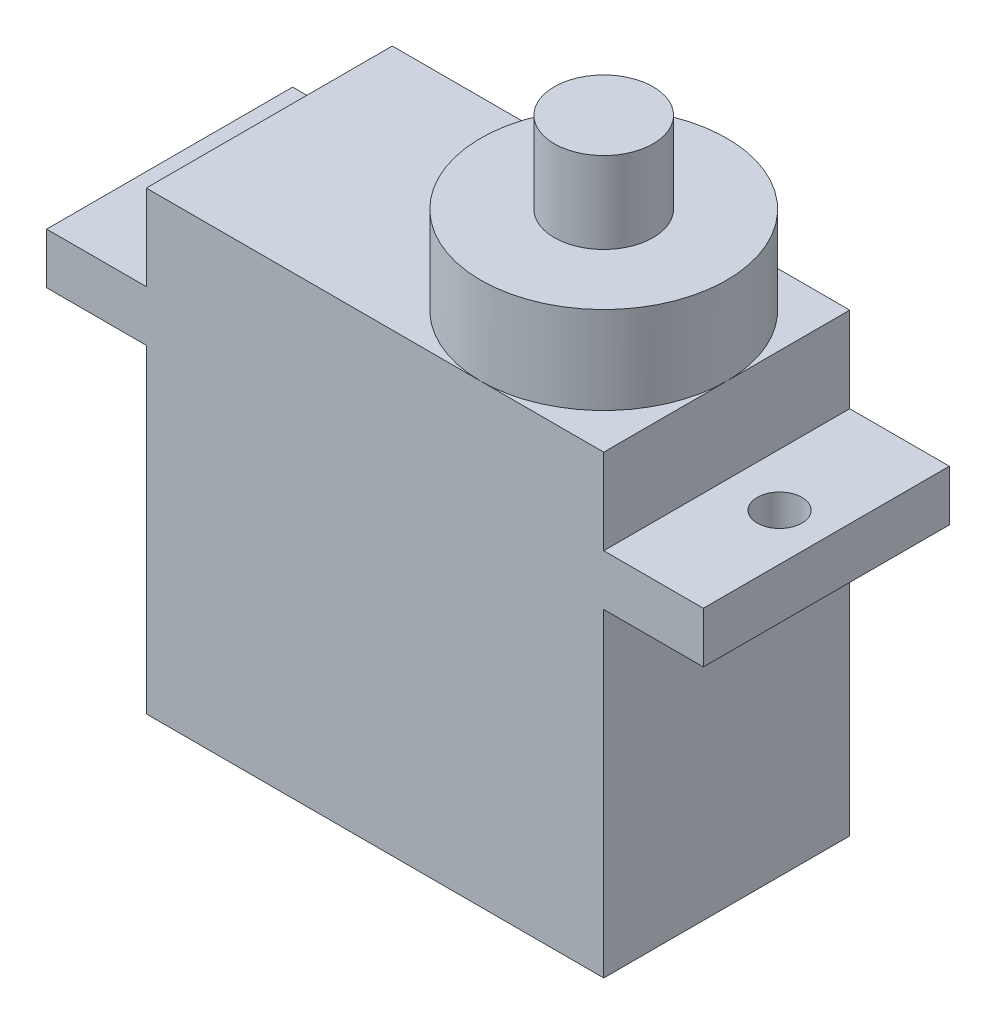
ISO-10303-21;
HEADER;
FILE_DESCRIPTION(('STEP AP214'),'2;1');
FILE_NAME('part.step','',(''),(''),'','','');
FILE_SCHEMA(('AUTOMOTIVE_DESIGN { 1 0 10303 214 1 1 1 1 }'));
ENDSEC;
DATA;
#1=APPLICATION_CONTEXT('core data for automotive mechanical design processes');
#2=APPLICATION_PROTOCOL_DEFINITION('international standard','automotive_design',2000,#1);
#3=PRODUCT_CONTEXT('',#1,'mechanical');
#4=PRODUCT('Part','Part','',(#3));
#5=PRODUCT_RELATED_PRODUCT_CATEGORY('part','',(#4));
#6=PRODUCT_DEFINITION_FORMATION('','',#4);
#7=PRODUCT_DEFINITION_CONTEXT('part definition',#1,'design');
#8=PRODUCT_DEFINITION('design','',#6,#7);
#9=PRODUCT_DEFINITION_SHAPE('','',#8);
#10=(LENGTH_UNIT() NAMED_UNIT(*) SI_UNIT(.MILLI.,.METRE.));
#11=(NAMED_UNIT(*) PLANE_ANGLE_UNIT() SI_UNIT($,.RADIAN.));
#12=(NAMED_UNIT(*) SI_UNIT($,.STERADIAN.) SOLID_ANGLE_UNIT());
#13=UNCERTAINTY_MEASURE_WITH_UNIT(LENGTH_MEASURE(1.E-05),#10,'distance_accuracy_value','');
#14=(GEOMETRIC_REPRESENTATION_CONTEXT(3) GLOBAL_UNCERTAINTY_ASSIGNED_CONTEXT((#13)) GLOBAL_UNIT_ASSIGNED_CONTEXT((#10,
#11,#12)) REPRESENTATION_CONTEXT('',''));
#15=CARTESIAN_POINT('',(0.,0.,0.));
#16=DIRECTION('',(0.,0.,1.));
#17=DIRECTION('',(1.,0.,0.));
#18=AXIS2_PLACEMENT_3D('',#15,#16,#17);
#19=CARTESIAN_POINT('',(22.5,22.4,12.1));
#20=DIRECTION('',(0.,-1.,0.));
#21=DIRECTION('',(0.,0.,-1.));
#22=AXIS2_PLACEMENT_3D('',#19,#20,#21);
#23=PLANE('',#22);
#24=CARTESIAN_POINT('',(16.45,22.4,6.05));
#25=DIRECTION('',(0.,1.,0.));
#26=DIRECTION('',(0.,0.,1.));
#27=AXIS2_PLACEMENT_3D('',#24,#25,#26);
#28=CIRCLE('',#27,6.05);
#29=CARTESIAN_POINT('',(16.45,22.4,12.1));
#30=VERTEX_POINT('',#29);
#31=CARTESIAN_POINT('',(22.5,22.4,6.05));
#32=VERTEX_POINT('',#31);
#33=EDGE_CURVE('E158',#30,#32,#28,.T.);
#34=ORIENTED_EDGE('',*,*,#33,.F.);
#35=DIRECTION('',(-1.,0.,0.));
#36=VECTOR('',#35,1.);
#37=CARTESIAN_POINT('',(22.5,22.4,12.1));
#38=LINE('',#37,#36);
#39=CARTESIAN_POINT('',(22.5,22.4,12.1));
#40=VERTEX_POINT('',#39);
#41=EDGE_CURVE('E140',#40,#30,#38,.T.);
#42=ORIENTED_EDGE('',*,*,#41,.F.);
#43=DIRECTION('',(0.,0.,-1.));
#44=VECTOR('',#43,1.);
#45=CARTESIAN_POINT('',(22.5,22.4,12.1));
#46=LINE('',#45,#44);
#47=EDGE_CURVE('E159',#40,#32,#46,.T.);
#48=ORIENTED_EDGE('',*,*,#47,.T.);
#49=EDGE_LOOP('',(#34,#42,#48));
#50=FACE_BOUND('',#49,.T.);
#51=ADVANCED_FACE('F40',(#50),#23,.F.);
#52=CARTESIAN_POINT('',(16.45,22.4,0.));
#53=VERTEX_POINT('',#52);
#54=EDGE_CURVE('E49',#32,#53,#28,.T.);
#55=ORIENTED_EDGE('',*,*,#54,.F.);
#56=CARTESIAN_POINT('',(22.5,22.4,0.));
#57=VERTEX_POINT('',#56);
#58=EDGE_CURVE('E230',#32,#57,#46,.T.);
#59=ORIENTED_EDGE('',*,*,#58,.T.);
#60=DIRECTION('',(-1.,0.,0.));
#61=VECTOR('',#60,1.);
#62=CARTESIAN_POINT('',(22.5,22.4,0.));
#63=LINE('',#62,#61);
#64=EDGE_CURVE('E209',#57,#53,#63,.T.);
#65=ORIENTED_EDGE('',*,*,#64,.T.);
#66=EDGE_LOOP('',(#55,#59,#65));
#67=FACE_BOUND('',#66,.T.);
#68=ADVANCED_FACE('F302',(#67),#23,.F.);
#69=CARTESIAN_POINT('',(0.,0.,12.1));
#70=DIRECTION('',(1.,0.,0.));
#71=DIRECTION('',(0.,0.,-1.));
#72=AXIS2_PLACEMENT_3D('',#69,#70,#71);
#73=PLANE('',#72);
#74=DIRECTION('',(0.,-1.,0.));
#75=VECTOR('',#74,1.);
#76=CARTESIAN_POINT('',(0.,0.,0.));
#77=LINE('',#76,#75);
#78=CARTESIAN_POINT('',(0.,15.7,0.));
#79=VERTEX_POINT('',#78);
#80=CARTESIAN_POINT('',(0.,0.,0.));
#81=VERTEX_POINT('',#80);
#82=EDGE_CURVE('E192',#79,#81,#77,.T.);
#83=ORIENTED_EDGE('',*,*,#82,.T.);
#84=DIRECTION('',(0.,0.,-1.));
#85=VECTOR('',#84,1.);
#86=CARTESIAN_POINT('',(0.,0.,12.1));
#87=LINE('',#86,#85);
#88=CARTESIAN_POINT('',(0.,0.,12.1));
#89=VERTEX_POINT('',#88);
#90=EDGE_CURVE('E165',#89,#81,#87,.T.);
#91=ORIENTED_EDGE('',*,*,#90,.F.);
#92=DIRECTION('',(0.,-1.,0.));
#93=VECTOR('',#92,1.);
#94=CARTESIAN_POINT('',(0.,0.,12.1));
#95=LINE('',#94,#93);
#96=CARTESIAN_POINT('',(0.,15.7,12.1));
#97=VERTEX_POINT('',#96);
#98=EDGE_CURVE('E170',#97,#89,#95,.T.);
#99=ORIENTED_EDGE('',*,*,#98,.F.);
#100=DIRECTION('',(0.,0.,-1.));
#101=VECTOR('',#100,1.);
#102=CARTESIAN_POINT('',(0.,15.7,12.1));
#103=LINE('',#102,#101);
#104=EDGE_CURVE('E191',#97,#79,#103,.T.);
#105=ORIENTED_EDGE('',*,*,#104,.T.);
#106=EDGE_LOOP('',(#83,#91,#99,#105));
#107=FACE_BOUND('',#106,.T.);
#108=ADVANCED_FACE('F42',(#107),#73,.F.);
#109=CARTESIAN_POINT('',(0.,0.,12.1));
#110=DIRECTION('',(0.,1.,0.));
#111=DIRECTION('',(0.,0.,1.));
#112=AXIS2_PLACEMENT_3D('',#109,#110,#111);
#113=PLANE('',#112);
#114=DIRECTION('',(1.,0.,0.));
#115=VECTOR('',#114,1.);
#116=CARTESIAN_POINT('',(0.,0.,0.));
#117=LINE('',#116,#115);
#118=CARTESIAN_POINT('',(22.5,0.,0.));
#119=VERTEX_POINT('',#118);
#120=EDGE_CURVE('E195',#81,#119,#117,.T.);
#121=ORIENTED_EDGE('',*,*,#120,.T.);
#122=DIRECTION('',(0.,0.,-1.));
#123=VECTOR('',#122,1.);
#124=CARTESIAN_POINT('',(22.5,0.,12.1));
#125=LINE('',#124,#123);
#126=CARTESIAN_POINT('',(22.5,0.,12.1));
#127=VERTEX_POINT('',#126);
#128=EDGE_CURVE('E167',#127,#119,#125,.T.);
#129=ORIENTED_EDGE('',*,*,#128,.F.);
#130=DIRECTION('',(1.,0.,0.));
#131=VECTOR('',#130,1.);
#132=CARTESIAN_POINT('',(0.,0.,12.1));
#133=LINE('',#132,#131);
#134=EDGE_CURVE('E172',#89,#127,#133,.T.);
#135=ORIENTED_EDGE('',*,*,#134,.F.);
#136=ORIENTED_EDGE('',*,*,#90,.T.);
#137=EDGE_LOOP('',(#121,#129,#135,#136));
#138=FACE_BOUND('',#137,.T.);
#139=ADVANCED_FACE('F270',(#138),#113,.F.);
#140=CARTESIAN_POINT('',(22.5,0.,12.1));
#141=DIRECTION('',(-1.,0.,0.));
#142=DIRECTION('',(0.,0.,1.));
#143=AXIS2_PLACEMENT_3D('',#140,#141,#142);
#144=PLANE('',#143);
#145=DIRECTION('',(0.,1.,0.));
#146=VECTOR('',#145,1.);
#147=CARTESIAN_POINT('',(22.5,0.,0.));
#148=LINE('',#147,#146);
#149=CARTESIAN_POINT('',(22.5,15.7,0.));
#150=VERTEX_POINT('',#149);
#151=EDGE_CURVE('E197',#119,#150,#148,.T.);
#152=ORIENTED_EDGE('',*,*,#151,.T.);
#153=DIRECTION('',(0.,0.,-1.));
#154=VECTOR('',#153,1.);
#155=CARTESIAN_POINT('',(22.5,15.7,12.1));
#156=LINE('',#155,#154);
#157=CARTESIAN_POINT('',(22.5,15.7,12.1));
#158=VERTEX_POINT('',#157);
#159=EDGE_CURVE('E241',#158,#150,#156,.T.);
#160=ORIENTED_EDGE('',*,*,#159,.F.);
#161=DIRECTION('',(0.,1.,0.));
#162=VECTOR('',#161,1.);
#163=CARTESIAN_POINT('',(22.5,0.,12.1));
#164=LINE('',#163,#162);
#165=EDGE_CURVE('E175',#127,#158,#164,.T.);
#166=ORIENTED_EDGE('',*,*,#165,.F.);
#167=ORIENTED_EDGE('',*,*,#128,.T.);
#168=EDGE_LOOP('',(#152,#160,#166,#167));
#169=FACE_BOUND('',#168,.T.);
#170=ADVANCED_FACE('F249',(#169),#144,.F.);
#171=CARTESIAN_POINT('',(22.5,15.7,12.1));
#172=DIRECTION('',(0.,1.,0.));
#173=DIRECTION('',(0.,0.,1.));
#174=AXIS2_PLACEMENT_3D('',#171,#172,#173);
#175=PLANE('',#174);
#176=CARTESIAN_POINT('',(25.1,15.7,6.05));
#177=DIRECTION('',(0.,1.,0.));
#178=DIRECTION('',(0.,0.,1.));
#179=AXIS2_PLACEMENT_3D('',#176,#177,#178);
#180=CIRCLE('',#179,1.1);
#181=CARTESIAN_POINT('',(25.1,15.7,7.15));
#182=VERTEX_POINT('',#181);
#183=EDGE_CURVE('E533',#182,#182,#180,.T.);
#184=ORIENTED_EDGE('',*,*,#183,.T.);
#185=EDGE_LOOP('',(#184));
#186=FACE_BOUND('',#185,.T.);
#187=DIRECTION('',(1.,0.,0.));
#188=VECTOR('',#187,1.);
#189=CARTESIAN_POINT('',(22.5,15.7,0.));
#190=LINE('',#189,#188);
#191=CARTESIAN_POINT('',(27.4,15.7,0.));
#192=VERTEX_POINT('',#191);
#193=EDGE_CURVE('E199',#150,#192,#190,.T.);
#194=ORIENTED_EDGE('',*,*,#193,.T.);
#195=DIRECTION('',(0.,0.,-1.));
#196=VECTOR('',#195,1.);
#197=CARTESIAN_POINT('',(27.4,15.7,12.1));
#198=LINE('',#197,#196);
#199=CARTESIAN_POINT('',(27.4,15.7,12.1));
#200=VERTEX_POINT('',#199);
#201=EDGE_CURVE('E238',#200,#192,#198,.T.);
#202=ORIENTED_EDGE('',*,*,#201,.F.);
#203=DIRECTION('',(1.,0.,0.));
#204=VECTOR('',#203,1.);
#205=CARTESIAN_POINT('',(22.5,15.7,12.1));
#206=LINE('',#205,#204);
#207=EDGE_CURVE('E177',#158,#200,#206,.T.);
#208=ORIENTED_EDGE('',*,*,#207,.F.);
#209=ORIENTED_EDGE('',*,*,#159,.T.);
#210=EDGE_LOOP('',(#194,#202,#208,#209));
#211=FACE_BOUND('',#210,.T.);
#212=ADVANCED_FACE('F260',(#186,#211),#175,.F.);
#213=CARTESIAN_POINT('',(27.4,15.7,12.1));
#214=DIRECTION('',(-1.,0.,0.));
#215=DIRECTION('',(0.,0.,1.));
#216=AXIS2_PLACEMENT_3D('',#213,#214,#215);
#217=PLANE('',#216);
#218=DIRECTION('',(0.,1.,0.));
#219=VECTOR('',#218,1.);
#220=CARTESIAN_POINT('',(27.4,15.7,0.));
#221=LINE('',#220,#219);
#222=CARTESIAN_POINT('',(27.4,18.2,0.));
#223=VERTEX_POINT('',#222);
#224=EDGE_CURVE('E201',#192,#223,#221,.T.);
#225=ORIENTED_EDGE('',*,*,#224,.T.);
#226=DIRECTION('',(0.,0.,-1.));
#227=VECTOR('',#226,1.);
#228=CARTESIAN_POINT('',(27.4,18.2,12.1));
#229=LINE('',#228,#227);
#230=CARTESIAN_POINT('',(27.4,18.2,12.1));
#231=VERTEX_POINT('',#230);
#232=EDGE_CURVE('E235',#231,#223,#229,.T.);
#233=ORIENTED_EDGE('',*,*,#232,.F.);
#234=DIRECTION('',(0.,1.,0.));
#235=VECTOR('',#234,1.);
#236=CARTESIAN_POINT('',(27.4,15.7,12.1));
#237=LINE('',#236,#235);
#238=EDGE_CURVE('E179',#200,#231,#237,.T.);
#239=ORIENTED_EDGE('',*,*,#238,.F.);
#240=ORIENTED_EDGE('',*,*,#201,.T.);
#241=EDGE_LOOP('',(#225,#233,#239,#240));
#242=FACE_BOUND('',#241,.T.);
#243=ADVANCED_FACE('F264',(#242),#217,.F.);
#244=CARTESIAN_POINT('',(27.4,18.2,12.1));
#245=DIRECTION('',(0.,-1.,0.));
#246=DIRECTION('',(0.,0.,-1.));
#247=AXIS2_PLACEMENT_3D('',#244,#245,#246);
#248=PLANE('',#247);
#249=CARTESIAN_POINT('',(25.1,18.2,6.05));
#250=DIRECTION('',(0.,1.,0.));
#251=DIRECTION('',(0.,0.,1.));
#252=AXIS2_PLACEMENT_3D('',#249,#250,#251);
#253=CIRCLE('',#252,1.1);
#254=CARTESIAN_POINT('',(25.1,18.2,7.15));
#255=VERTEX_POINT('',#254);
#256=EDGE_CURVE('E530',#255,#255,#253,.T.);
#257=ORIENTED_EDGE('',*,*,#256,.F.);
#258=EDGE_LOOP('',(#257));
#259=FACE_BOUND('',#258,.T.);
#260=DIRECTION('',(-1.,0.,0.));
#261=VECTOR('',#260,1.);
#262=CARTESIAN_POINT('',(27.4,18.2,0.));
#263=LINE('',#262,#261);
#264=CARTESIAN_POINT('',(22.5,18.2,0.));
#265=VERTEX_POINT('',#264);
#266=EDGE_CURVE('E203',#223,#265,#263,.T.);
#267=ORIENTED_EDGE('',*,*,#266,.T.);
#268=DIRECTION('',(0.,0.,-1.));
#269=VECTOR('',#268,1.);
#270=CARTESIAN_POINT('',(22.5,18.2,12.1));
#271=LINE('',#270,#269);
#272=CARTESIAN_POINT('',(22.5,18.2,12.1));
#273=VERTEX_POINT('',#272);
#274=EDGE_CURVE('E232',#273,#265,#271,.T.);
#275=ORIENTED_EDGE('',*,*,#274,.F.);
#276=DIRECTION('',(-1.,0.,0.));
#277=VECTOR('',#276,1.);
#278=CARTESIAN_POINT('',(27.4,18.2,12.1));
#279=LINE('',#278,#277);
#280=EDGE_CURVE('E181',#231,#273,#279,.T.);
#281=ORIENTED_EDGE('',*,*,#280,.F.);
#282=ORIENTED_EDGE('',*,*,#232,.T.);
#283=EDGE_LOOP('',(#267,#275,#281,#282));
#284=FACE_BOUND('',#283,.T.);
#285=ADVANCED_FACE('F310',(#259,#284),#248,.F.);
#286=CARTESIAN_POINT('',(22.5,18.2,12.1));
#287=DIRECTION('',(-1.,0.,0.));
#288=DIRECTION('',(0.,0.,1.));
#289=AXIS2_PLACEMENT_3D('',#286,#287,#288);
#290=PLANE('',#289);
#291=DIRECTION('',(0.,1.,0.));
#292=VECTOR('',#291,1.);
#293=CARTESIAN_POINT('',(22.5,18.2,0.));
#294=LINE('',#293,#292);
#295=EDGE_CURVE('E205',#265,#57,#294,.T.);
#296=ORIENTED_EDGE('',*,*,#295,.T.);
#297=ORIENTED_EDGE('',*,*,#58,.F.);
#298=ORIENTED_EDGE('',*,*,#47,.F.);
#299=DIRECTION('',(0.,1.,0.));
#300=VECTOR('',#299,1.);
#301=CARTESIAN_POINT('',(22.5,18.2,12.1));
#302=LINE('',#301,#300);
#303=EDGE_CURVE('E146',#273,#40,#302,.T.);
#304=ORIENTED_EDGE('',*,*,#303,.F.);
#305=ORIENTED_EDGE('',*,*,#274,.T.);
#306=EDGE_LOOP('',(#296,#297,#298,#304,#305));
#307=FACE_BOUND('',#306,.T.);
#308=ADVANCED_FACE('F300',(#307),#290,.F.);
#309=EDGE_CURVE('E64',#53,#30,#28,.T.);
#310=ORIENTED_EDGE('',*,*,#309,.F.);
#311=CARTESIAN_POINT('',(0.,22.4,0.));
#312=VERTEX_POINT('',#311);
#313=EDGE_CURVE('E208',#53,#312,#63,.T.);
#314=ORIENTED_EDGE('',*,*,#313,.T.);
#315=DIRECTION('',(0.,0.,-1.));
#316=VECTOR('',#315,1.);
#317=CARTESIAN_POINT('',(0.,22.4,12.1));
#318=LINE('',#317,#316);
#319=CARTESIAN_POINT('',(0.,22.4,12.1));
#320=VERTEX_POINT('',#319);
#321=EDGE_CURVE('E155',#320,#312,#318,.T.);
#322=ORIENTED_EDGE('',*,*,#321,.F.);
#323=EDGE_CURVE('E143',#30,#320,#38,.T.);
#324=ORIENTED_EDGE('',*,*,#323,.F.);
#325=EDGE_LOOP('',(#310,#314,#322,#324));
#326=FACE_BOUND('',#325,.T.);
#327=ADVANCED_FACE('F153',(#326),#23,.F.);
#328=CARTESIAN_POINT('',(0.,22.4,12.1));
#329=DIRECTION('',(1.,0.,0.));
#330=DIRECTION('',(0.,0.,-1.));
#331=AXIS2_PLACEMENT_3D('',#328,#329,#330);
#332=PLANE('',#331);
#333=DIRECTION('',(0.,-1.,0.));
#334=VECTOR('',#333,1.);
#335=CARTESIAN_POINT('',(0.,22.4,0.));
#336=LINE('',#335,#334);
#337=CARTESIAN_POINT('',(0.,18.2,0.));
#338=VERTEX_POINT('',#337);
#339=EDGE_CURVE('E211',#312,#338,#336,.T.);
#340=ORIENTED_EDGE('',*,*,#339,.T.);
#341=DIRECTION('',(0.,0.,-1.));
#342=VECTOR('',#341,1.);
#343=CARTESIAN_POINT('',(0.,18.2,12.1));
#344=LINE('',#343,#342);
#345=CARTESIAN_POINT('',(0.,18.2,12.1));
#346=VERTEX_POINT('',#345);
#347=EDGE_CURVE('E226',#346,#338,#344,.T.);
#348=ORIENTED_EDGE('',*,*,#347,.F.);
#349=DIRECTION('',(0.,-1.,0.));
#350=VECTOR('',#349,1.);
#351=CARTESIAN_POINT('',(0.,22.4,12.1));
#352=LINE('',#351,#350);
#353=EDGE_CURVE('E151',#320,#346,#352,.T.);
#354=ORIENTED_EDGE('',*,*,#353,.F.);
#355=ORIENTED_EDGE('',*,*,#321,.T.);
#356=EDGE_LOOP('',(#340,#348,#354,#355));
#357=FACE_BOUND('',#356,.T.);
#358=ADVANCED_FACE('F291',(#357),#332,.F.);
#359=CARTESIAN_POINT('',(0.,18.2,12.1));
#360=DIRECTION('',(0.,-1.,0.));
#361=DIRECTION('',(0.,0.,-1.));
#362=AXIS2_PLACEMENT_3D('',#359,#360,#361);
#363=PLANE('',#362);
#364=CARTESIAN_POINT('',(-2.6,18.2,6.05));
#365=DIRECTION('',(0.,1.,0.));
#366=DIRECTION('',(0.,0.,1.));
#367=AXIS2_PLACEMENT_3D('',#364,#365,#366);
#368=CIRCLE('',#367,1.1);
#369=CARTESIAN_POINT('',(-2.6,18.2,7.15));
#370=VERTEX_POINT('',#369);
#371=EDGE_CURVE('E539',#370,#370,#368,.T.);
#372=ORIENTED_EDGE('',*,*,#371,.F.);
#373=EDGE_LOOP('',(#372));
#374=FACE_BOUND('',#373,.T.);
#375=DIRECTION('',(-1.,0.,0.));
#376=VECTOR('',#375,1.);
#377=CARTESIAN_POINT('',(0.,18.2,0.));
#378=LINE('',#377,#376);
#379=CARTESIAN_POINT('',(-4.9,18.2,0.));
#380=VERTEX_POINT('',#379);
#381=EDGE_CURVE('E213',#338,#380,#378,.T.);
#382=ORIENTED_EDGE('',*,*,#381,.T.);
#383=DIRECTION('',(0.,0.,-1.));
#384=VECTOR('',#383,1.);
#385=CARTESIAN_POINT('',(-4.9,18.2,12.1));
#386=LINE('',#385,#384);
#387=CARTESIAN_POINT('',(-4.9,18.2,12.1));
#388=VERTEX_POINT('',#387);
#389=EDGE_CURVE('E223',#388,#380,#386,.T.);
#390=ORIENTED_EDGE('',*,*,#389,.F.);
#391=DIRECTION('',(-1.,0.,0.));
#392=VECTOR('',#391,1.);
#393=CARTESIAN_POINT('',(0.,18.2,12.1));
#394=LINE('',#393,#392);
#395=EDGE_CURVE('E185',#346,#388,#394,.T.);
#396=ORIENTED_EDGE('',*,*,#395,.F.);
#397=ORIENTED_EDGE('',*,*,#347,.T.);
#398=EDGE_LOOP('',(#382,#390,#396,#397));
#399=FACE_BOUND('',#398,.T.);
#400=ADVANCED_FACE('F286',(#374,#399),#363,.F.);
#401=CARTESIAN_POINT('',(-4.9,18.2,12.1));
#402=DIRECTION('',(1.,0.,0.));
#403=DIRECTION('',(0.,0.,-1.));
#404=AXIS2_PLACEMENT_3D('',#401,#402,#403);
#405=PLANE('',#404);
#406=DIRECTION('',(0.,-1.,0.));
#407=VECTOR('',#406,1.);
#408=CARTESIAN_POINT('',(-4.9,18.2,0.));
#409=LINE('',#408,#407);
#410=CARTESIAN_POINT('',(-4.9,15.7,0.));
#411=VERTEX_POINT('',#410);
#412=EDGE_CURVE('E215',#380,#411,#409,.T.);
#413=ORIENTED_EDGE('',*,*,#412,.T.);
#414=DIRECTION('',(0.,0.,-1.));
#415=VECTOR('',#414,1.);
#416=CARTESIAN_POINT('',(-4.9,15.7,12.1));
#417=LINE('',#416,#415);
#418=CARTESIAN_POINT('',(-4.9,15.7,12.1));
#419=VERTEX_POINT('',#418);
#420=EDGE_CURVE('E220',#419,#411,#417,.T.);
#421=ORIENTED_EDGE('',*,*,#420,.F.);
#422=DIRECTION('',(0.,-1.,0.));
#423=VECTOR('',#422,1.);
#424=CARTESIAN_POINT('',(-4.9,18.2,12.1));
#425=LINE('',#424,#423);
#426=EDGE_CURVE('E187',#388,#419,#425,.T.);
#427=ORIENTED_EDGE('',*,*,#426,.F.);
#428=ORIENTED_EDGE('',*,*,#389,.T.);
#429=EDGE_LOOP('',(#413,#421,#427,#428));
#430=FACE_BOUND('',#429,.T.);
#431=ADVANCED_FACE('F282',(#430),#405,.F.);
#432=CARTESIAN_POINT('',(0.,15.7,12.1));
#433=DIRECTION('',(0.,1.,0.));
#434=DIRECTION('',(0.,0.,1.));
#435=AXIS2_PLACEMENT_3D('',#432,#433,#434);
#436=PLANE('',#435);
#437=CARTESIAN_POINT('',(-2.6,15.7,6.05));
#438=DIRECTION('',(0.,1.,0.));
#439=DIRECTION('',(0.,0.,1.));
#440=AXIS2_PLACEMENT_3D('',#437,#438,#439);
#441=CIRCLE('',#440,1.1);
#442=CARTESIAN_POINT('',(-2.6,15.7,7.15));
#443=VERTEX_POINT('',#442);
#444=EDGE_CURVE('E44',#443,#443,#441,.T.);
#445=ORIENTED_EDGE('',*,*,#444,.T.);
#446=EDGE_LOOP('',(#445));
#447=FACE_BOUND('',#446,.T.);
#448=DIRECTION('',(1.,0.,0.));
#449=VECTOR('',#448,1.);
#450=CARTESIAN_POINT('',(0.,15.7,0.));
#451=LINE('',#450,#449);
#452=EDGE_CURVE('E173',#411,#79,#451,.T.);
#453=ORIENTED_EDGE('',*,*,#452,.T.);
#454=ORIENTED_EDGE('',*,*,#104,.F.);
#455=DIRECTION('',(1.,0.,0.));
#456=VECTOR('',#455,1.);
#457=CARTESIAN_POINT('',(0.,15.7,12.1));
#458=LINE('',#457,#456);
#459=EDGE_CURVE('E189',#419,#97,#458,.T.);
#460=ORIENTED_EDGE('',*,*,#459,.F.);
#461=ORIENTED_EDGE('',*,*,#420,.T.);
#462=EDGE_LOOP('',(#453,#454,#460,#461));
#463=FACE_BOUND('',#462,.T.);
#464=ADVANCED_FACE('F277',(#447,#463),#436,.F.);
#465=CARTESIAN_POINT('',(0.,0.,12.1));
#466=DIRECTION('',(0.,0.,1.));
#467=DIRECTION('',(1.,0.,0.));
#468=AXIS2_PLACEMENT_3D('',#465,#466,#467);
#469=PLANE('',#468);
#470=ORIENTED_EDGE('',*,*,#98,.T.);
#471=ORIENTED_EDGE('',*,*,#134,.T.);
#472=ORIENTED_EDGE('',*,*,#165,.T.);
#473=ORIENTED_EDGE('',*,*,#207,.T.);
#474=ORIENTED_EDGE('',*,*,#238,.T.);
#475=ORIENTED_EDGE('',*,*,#280,.T.);
#476=ORIENTED_EDGE('',*,*,#303,.T.);
#477=ORIENTED_EDGE('',*,*,#41,.T.);
#478=ORIENTED_EDGE('',*,*,#323,.T.);
#479=ORIENTED_EDGE('',*,*,#353,.T.);
#480=ORIENTED_EDGE('',*,*,#395,.T.);
#481=ORIENTED_EDGE('',*,*,#426,.T.);
#482=ORIENTED_EDGE('',*,*,#459,.T.);
#483=EDGE_LOOP('',(#470,#471,#472,#473,#474,#475,#476,#477,#478,#479,#480,#481,#482));
#484=FACE_BOUND('',#483,.T.);
#485=ADVANCED_FACE('F142',(#484),#469,.T.);
#486=CARTESIAN_POINT('',(0.,0.,0.));
#487=DIRECTION('',(0.,0.,1.));
#488=DIRECTION('',(1.,0.,0.));
#489=AXIS2_PLACEMENT_3D('',#486,#487,#488);
#490=PLANE('',#489);
#491=ORIENTED_EDGE('',*,*,#82,.F.);
#492=ORIENTED_EDGE('',*,*,#452,.F.);
#493=ORIENTED_EDGE('',*,*,#412,.F.);
#494=ORIENTED_EDGE('',*,*,#381,.F.);
#495=ORIENTED_EDGE('',*,*,#339,.F.);
#496=ORIENTED_EDGE('',*,*,#313,.F.);
#497=ORIENTED_EDGE('',*,*,#64,.F.);
#498=ORIENTED_EDGE('',*,*,#295,.F.);
#499=ORIENTED_EDGE('',*,*,#266,.F.);
#500=ORIENTED_EDGE('',*,*,#224,.F.);
#501=ORIENTED_EDGE('',*,*,#193,.F.);
#502=ORIENTED_EDGE('',*,*,#151,.F.);
#503=ORIENTED_EDGE('',*,*,#120,.F.);
#504=EDGE_LOOP('',(#491,#492,#493,#494,#495,#496,#497,#498,#499,#500,#501,#502,#503));
#505=FACE_BOUND('',#504,.T.);
#506=ADVANCED_FACE('F255',(#505),#490,.F.);
#507=CARTESIAN_POINT('',(16.45,26.7,6.05));
#508=DIRECTION('',(0.,-1.,0.));
#509=DIRECTION('',(0.,0.,-1.));
#510=AXIS2_PLACEMENT_3D('',#507,#508,#509);
#511=CYLINDRICAL_SURFACE('',#510,6.05);
#512=CARTESIAN_POINT('',(16.45,26.7,6.05));
#513=DIRECTION('',(0.,1.,0.));
#514=DIRECTION('',(0.,0.,1.));
#515=AXIS2_PLACEMENT_3D('',#512,#513,#514);
#516=CIRCLE('',#515,6.05);
#517=CARTESIAN_POINT('',(16.45,26.7,12.1));
#518=VERTEX_POINT('',#517);
#519=EDGE_CURVE('E161',#518,#518,#516,.T.);
#520=ORIENTED_EDGE('',*,*,#519,.F.);
#521=EDGE_LOOP('',(#520));
#522=FACE_BOUND('',#521,.T.);
#523=ORIENTED_EDGE('',*,*,#33,.T.);
#524=ORIENTED_EDGE('',*,*,#54,.T.);
#525=ORIENTED_EDGE('',*,*,#309,.T.);
#526=EDGE_LOOP('',(#523,#524,#525));
#527=FACE_BOUND('',#526,.T.);
#528=ADVANCED_FACE('F164',(#522,#527),#511,.T.);
#529=CARTESIAN_POINT('',(16.45,26.7,6.05));
#530=DIRECTION('',(0.,1.,0.));
#531=DIRECTION('',(0.,0.,1.));
#532=AXIS2_PLACEMENT_3D('',#529,#530,#531);
#533=PLANE('',#532);
#534=CARTESIAN_POINT('',(16.45,26.7,6.05));
#535=DIRECTION('',(0.,1.,0.));
#536=DIRECTION('',(0.,0.,1.));
#537=AXIS2_PLACEMENT_3D('',#534,#535,#536);
#538=CIRCLE('',#537,2.43);
#539=CARTESIAN_POINT('',(16.45,26.7,8.48));
#540=VERTEX_POINT('',#539);
#541=EDGE_CURVE('E11',#540,#540,#538,.T.);
#542=ORIENTED_EDGE('',*,*,#541,.F.);
#543=EDGE_LOOP('',(#542));
#544=FACE_BOUND('',#543,.T.);
#545=ORIENTED_EDGE('',*,*,#519,.T.);
#546=EDGE_LOOP('',(#545));
#547=FACE_BOUND('',#546,.T.);
#548=ADVANCED_FACE('F380',(#544,#547),#533,.T.);
#549=CARTESIAN_POINT('',(16.45,30.7,6.05));
#550=DIRECTION('',(0.,-1.,0.));
#551=DIRECTION('',(0.,0.,-1.));
#552=AXIS2_PLACEMENT_3D('',#549,#550,#551);
#553=CYLINDRICAL_SURFACE('',#552,2.43);
#554=CARTESIAN_POINT('',(16.45,30.7,6.05));
#555=DIRECTION('',(0.,1.,0.));
#556=DIRECTION('',(0.,0.,1.));
#557=AXIS2_PLACEMENT_3D('',#554,#555,#556);
#558=CIRCLE('',#557,2.43);
#559=CARTESIAN_POINT('',(16.45,30.7,8.48));
#560=VERTEX_POINT('',#559);
#561=EDGE_CURVE('E162',#560,#560,#558,.T.);
#562=ORIENTED_EDGE('',*,*,#561,.F.);
#563=EDGE_LOOP('',(#562));
#564=FACE_BOUND('',#563,.T.);
#565=ORIENTED_EDGE('',*,*,#541,.T.);
#566=EDGE_LOOP('',(#565));
#567=FACE_BOUND('',#566,.T.);
#568=ADVANCED_FACE('F391',(#564,#567),#553,.T.);
#569=CARTESIAN_POINT('',(16.45,30.7,6.05));
#570=DIRECTION('',(0.,1.,0.));
#571=DIRECTION('',(0.,0.,1.));
#572=AXIS2_PLACEMENT_3D('',#569,#570,#571);
#573=PLANE('',#572);
#574=ORIENTED_EDGE('',*,*,#561,.T.);
#575=EDGE_LOOP('',(#574));
#576=FACE_BOUND('',#575,.T.);
#577=ADVANCED_FACE('F402',(#576),#573,.T.);
#578=CARTESIAN_POINT('',(-2.6,14.2,6.05));
#579=DIRECTION('',(0.,1.,0.));
#580=DIRECTION('',(0.,0.,1.));
#581=AXIS2_PLACEMENT_3D('',#578,#579,#580);
#582=CYLINDRICAL_SURFACE('',#581,1.1);
#583=ORIENTED_EDGE('',*,*,#371,.T.);
#584=EDGE_LOOP('',(#583));
#585=FACE_BOUND('',#584,.T.);
#586=ORIENTED_EDGE('',*,*,#444,.F.);
#587=EDGE_LOOP('',(#586));
#588=FACE_BOUND('',#587,.T.);
#589=ADVANCED_FACE('F413',(#585,#588),#582,.F.);
#590=CARTESIAN_POINT('',(25.1,14.2,6.05));
#591=DIRECTION('',(0.,1.,0.));
#592=DIRECTION('',(0.,0.,1.));
#593=AXIS2_PLACEMENT_3D('',#590,#591,#592);
#594=CYLINDRICAL_SURFACE('',#593,1.1);
#595=ORIENTED_EDGE('',*,*,#256,.T.);
#596=EDGE_LOOP('',(#595));
#597=FACE_BOUND('',#596,.T.);
#598=ORIENTED_EDGE('',*,*,#183,.F.);
#599=EDGE_LOOP('',(#598));
#600=FACE_BOUND('',#599,.T.);
#601=ADVANCED_FACE('F456',(#597,#600),#594,.F.);
#602=CLOSED_SHELL('',(#51,#68,#108,#139,#170,#212,#243,#285,#308,#327,#358,#400,#431,#464,#485,
#506,#528,#548,#568,#577,#589,#601));
#603=MANIFOLD_SOLID_BREP('B2',#602);
#604=ADVANCED_BREP_SHAPE_REPRESENTATION('',(#18,#603),#14);
#605=SHAPE_DEFINITION_REPRESENTATION(#9,#604);
ENDSEC;
END-ISO-10303-21;
